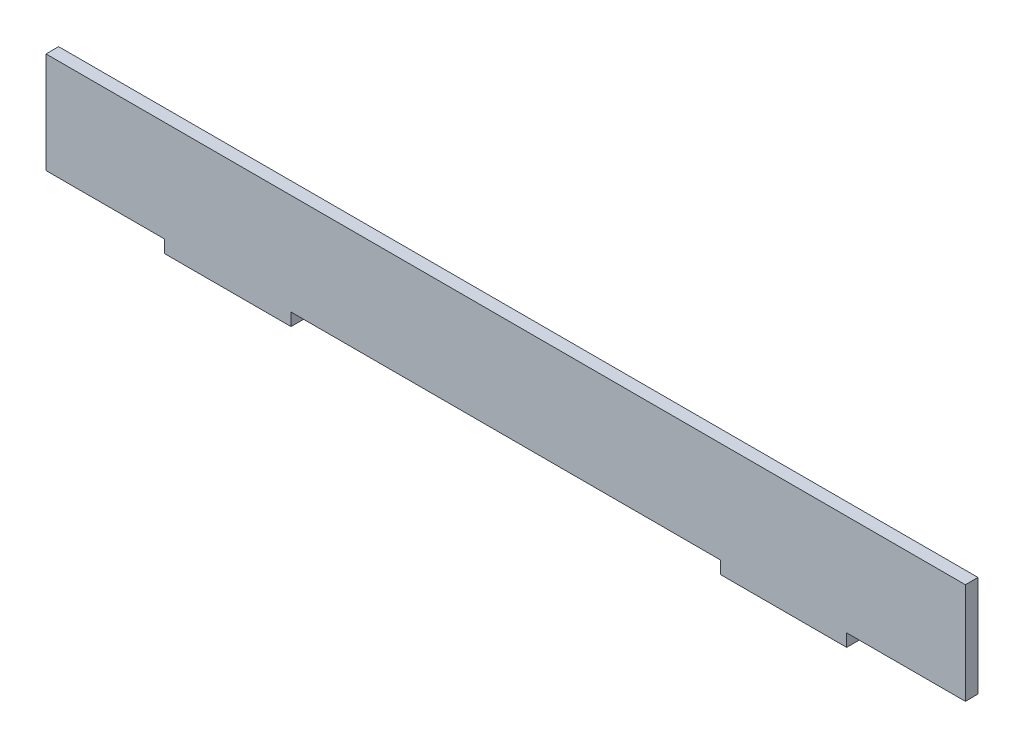
ISO-10303-21;
HEADER;
FILE_DESCRIPTION(('STEP AP214'),'2;1');
FILE_NAME('part.step','',(''),(''),'','','');
FILE_SCHEMA(('AUTOMOTIVE_DESIGN { 1 0 10303 214 1 1 1 1 }'));
ENDSEC;
DATA;
#1=APPLICATION_CONTEXT('core data for automotive mechanical design processes');
#2=APPLICATION_PROTOCOL_DEFINITION('international standard','automotive_design',2000,#1);
#3=PRODUCT_CONTEXT('',#1,'mechanical');
#4=PRODUCT('Part','Part','',(#3));
#5=PRODUCT_RELATED_PRODUCT_CATEGORY('part','',(#4));
#6=PRODUCT_DEFINITION_FORMATION('','',#4);
#7=PRODUCT_DEFINITION_CONTEXT('part definition',#1,'design');
#8=PRODUCT_DEFINITION('design','',#6,#7);
#9=PRODUCT_DEFINITION_SHAPE('','',#8);
#10=(LENGTH_UNIT() NAMED_UNIT(*) SI_UNIT(.MILLI.,.METRE.));
#11=(NAMED_UNIT(*) PLANE_ANGLE_UNIT() SI_UNIT($,.RADIAN.));
#12=(NAMED_UNIT(*) SI_UNIT($,.STERADIAN.) SOLID_ANGLE_UNIT());
#13=UNCERTAINTY_MEASURE_WITH_UNIT(LENGTH_MEASURE(1.E-05),#10,'distance_accuracy_value','');
#14=(GEOMETRIC_REPRESENTATION_CONTEXT(3) GLOBAL_UNCERTAINTY_ASSIGNED_CONTEXT((#13)) GLOBAL_UNIT_ASSIGNED_CONTEXT((#10,
#11,#12)) REPRESENTATION_CONTEXT('',''));
#15=CARTESIAN_POINT('',(0.,0.,0.));
#16=DIRECTION('',(0.,0.,1.));
#17=DIRECTION('',(1.,0.,0.));
#18=AXIS2_PLACEMENT_3D('',#15,#16,#17);
#19=CARTESIAN_POINT('',(-182.,-20.,5.));
#20=DIRECTION('',(0.,1.,0.));
#21=DIRECTION('',(0.,0.,1.));
#22=AXIS2_PLACEMENT_3D('',#19,#20,#21);
#23=PLANE('',#22);
#24=DIRECTION('',(1.,0.,0.));
#25=VECTOR('',#24,1.);
#26=CARTESIAN_POINT('',(-182.,-20.,5.));
#27=LINE('',#26,#25);
#28=CARTESIAN_POINT('',(-85.,-20.,5.));
#29=VERTEX_POINT('',#28);
#30=CARTESIAN_POINT('',(85.,-20.,5.));
#31=VERTEX_POINT('',#30);
#32=EDGE_CURVE('E50',#29,#31,#27,.T.);
#33=ORIENTED_EDGE('',*,*,#32,.F.);
#34=DIRECTION('',(0.,0.,-1.));
#35=VECTOR('',#34,1.);
#36=CARTESIAN_POINT('',(-85.,-20.,5.));
#37=LINE('',#36,#35);
#38=CARTESIAN_POINT('',(-85.,-20.,0.));
#39=VERTEX_POINT('',#38);
#40=EDGE_CURVE('E148',#29,#39,#37,.T.);
#41=ORIENTED_EDGE('',*,*,#40,.T.);
#42=DIRECTION('',(1.,0.,0.));
#43=VECTOR('',#42,1.);
#44=CARTESIAN_POINT('',(-182.,-20.,0.));
#45=LINE('',#44,#43);
#46=CARTESIAN_POINT('',(85.,-20.,0.));
#47=VERTEX_POINT('',#46);
#48=EDGE_CURVE('E209',#39,#47,#45,.T.);
#49=ORIENTED_EDGE('',*,*,#48,.T.);
#50=DIRECTION('',(0.,0.,-1.));
#51=VECTOR('',#50,1.);
#52=CARTESIAN_POINT('',(85.,-20.,5.));
#53=LINE('',#52,#51);
#54=EDGE_CURVE('E184',#31,#47,#53,.T.);
#55=ORIENTED_EDGE('',*,*,#54,.F.);
#56=EDGE_LOOP('',(#33,#41,#49,#55));
#57=FACE_BOUND('',#56,.T.);
#58=ADVANCED_FACE('F35',(#57),#23,.F.);
#59=CARTESIAN_POINT('',(-182.,-20.,0.));
#60=VERTEX_POINT('',#59);
#61=CARTESIAN_POINT('',(-135.,-20.,0.));
#62=VERTEX_POINT('',#61);
#63=EDGE_CURVE('E193',#60,#62,#45,.T.);
#64=ORIENTED_EDGE('',*,*,#63,.T.);
#65=DIRECTION('',(0.,0.,-1.));
#66=VECTOR('',#65,1.);
#67=CARTESIAN_POINT('',(-135.,-20.,5.));
#68=LINE('',#67,#66);
#69=CARTESIAN_POINT('',(-135.,-20.,5.));
#70=VERTEX_POINT('',#69);
#71=EDGE_CURVE('E58',#70,#62,#68,.T.);
#72=ORIENTED_EDGE('',*,*,#71,.F.);
#73=CARTESIAN_POINT('',(-182.,-20.,5.));
#74=VERTEX_POINT('',#73);
#75=EDGE_CURVE('E198',#74,#70,#27,.T.);
#76=ORIENTED_EDGE('',*,*,#75,.F.);
#77=DIRECTION('',(0.,0.,-1.));
#78=VECTOR('',#77,1.);
#79=CARTESIAN_POINT('',(-182.,-20.,5.));
#80=LINE('',#79,#78);
#81=EDGE_CURVE('E212',#74,#60,#80,.T.);
#82=ORIENTED_EDGE('',*,*,#81,.T.);
#83=EDGE_LOOP('',(#64,#72,#76,#82));
#84=FACE_BOUND('',#83,.T.);
#85=ADVANCED_FACE('F227',(#84),#23,.F.);
#86=CARTESIAN_POINT('',(182.,20.,5.));
#87=DIRECTION('',(-1.,0.,0.));
#88=DIRECTION('',(0.,0.,1.));
#89=AXIS2_PLACEMENT_3D('',#86,#87,#88);
#90=PLANE('',#89);
#91=DIRECTION('',(0.,1.,0.));
#92=VECTOR('',#91,1.);
#93=CARTESIAN_POINT('',(182.,20.,0.));
#94=LINE('',#93,#92);
#95=CARTESIAN_POINT('',(182.,-20.,0.));
#96=VERTEX_POINT('',#95);
#97=CARTESIAN_POINT('',(182.,20.,0.));
#98=VERTEX_POINT('',#97);
#99=EDGE_CURVE('E183',#96,#98,#94,.T.);
#100=ORIENTED_EDGE('',*,*,#99,.T.);
#101=DIRECTION('',(0.,0.,-1.));
#102=VECTOR('',#101,1.);
#103=CARTESIAN_POINT('',(182.,20.,5.));
#104=LINE('',#103,#102);
#105=CARTESIAN_POINT('',(182.,20.,5.));
#106=VERTEX_POINT('',#105);
#107=EDGE_CURVE('E11',#106,#98,#104,.T.);
#108=ORIENTED_EDGE('',*,*,#107,.F.);
#109=DIRECTION('',(0.,1.,0.));
#110=VECTOR('',#109,1.);
#111=CARTESIAN_POINT('',(182.,20.,5.));
#112=LINE('',#111,#110);
#113=CARTESIAN_POINT('',(182.,-20.,5.));
#114=VERTEX_POINT('',#113);
#115=EDGE_CURVE('E190',#114,#106,#112,.T.);
#116=ORIENTED_EDGE('',*,*,#115,.F.);
#117=DIRECTION('',(0.,0.,-1.));
#118=VECTOR('',#117,1.);
#119=CARTESIAN_POINT('',(182.,-20.,5.));
#120=LINE('',#119,#118);
#121=EDGE_CURVE('E200',#114,#96,#120,.T.);
#122=ORIENTED_EDGE('',*,*,#121,.T.);
#123=EDGE_LOOP('',(#100,#108,#116,#122));
#124=FACE_BOUND('',#123,.T.);
#125=ADVANCED_FACE('F37',(#124),#90,.F.);
#126=CARTESIAN_POINT('',(-182.,20.,5.));
#127=DIRECTION('',(0.,-1.,0.));
#128=DIRECTION('',(0.,0.,-1.));
#129=AXIS2_PLACEMENT_3D('',#126,#127,#128);
#130=PLANE('',#129);
#131=DIRECTION('',(-1.,0.,0.));
#132=VECTOR('',#131,1.);
#133=CARTESIAN_POINT('',(-182.,20.,0.));
#134=LINE('',#133,#132);
#135=CARTESIAN_POINT('',(-182.,20.,0.));
#136=VERTEX_POINT('',#135);
#137=EDGE_CURVE('E203',#98,#136,#134,.T.);
#138=ORIENTED_EDGE('',*,*,#137,.T.);
#139=DIRECTION('',(0.,0.,-1.));
#140=VECTOR('',#139,1.);
#141=CARTESIAN_POINT('',(-182.,20.,5.));
#142=LINE('',#141,#140);
#143=CARTESIAN_POINT('',(-182.,20.,5.));
#144=VERTEX_POINT('',#143);
#145=EDGE_CURVE('E43',#144,#136,#142,.T.);
#146=ORIENTED_EDGE('',*,*,#145,.F.);
#147=DIRECTION('',(-1.,0.,0.));
#148=VECTOR('',#147,1.);
#149=CARTESIAN_POINT('',(-182.,20.,5.));
#150=LINE('',#149,#148);
#151=EDGE_CURVE('E192',#106,#144,#150,.T.);
#152=ORIENTED_EDGE('',*,*,#151,.F.);
#153=ORIENTED_EDGE('',*,*,#107,.T.);
#154=EDGE_LOOP('',(#138,#146,#152,#153));
#155=FACE_BOUND('',#154,.T.);
#156=ADVANCED_FACE('F248',(#155),#130,.F.);
#157=CARTESIAN_POINT('',(-182.,20.,5.));
#158=DIRECTION('',(1.,0.,0.));
#159=DIRECTION('',(0.,1.,0.));
#160=AXIS2_PLACEMENT_3D('',#157,#158,#159);
#161=PLANE('',#160);
#162=DIRECTION('',(0.,-1.,0.));
#163=VECTOR('',#162,1.);
#164=CARTESIAN_POINT('',(-182.,20.,0.));
#165=LINE('',#164,#163);
#166=EDGE_CURVE('E205',#136,#60,#165,.T.);
#167=ORIENTED_EDGE('',*,*,#166,.T.);
#168=ORIENTED_EDGE('',*,*,#81,.F.);
#169=DIRECTION('',(0.,-1.,0.));
#170=VECTOR('',#169,1.);
#171=CARTESIAN_POINT('',(-182.,20.,5.));
#172=LINE('',#171,#170);
#173=EDGE_CURVE('E195',#144,#74,#172,.T.);
#174=ORIENTED_EDGE('',*,*,#173,.F.);
#175=ORIENTED_EDGE('',*,*,#145,.T.);
#176=EDGE_LOOP('',(#167,#168,#174,#175));
#177=FACE_BOUND('',#176,.T.);
#178=ADVANCED_FACE('F219',(#177),#161,.F.);
#179=CARTESIAN_POINT('',(135.,-20.,5.));
#180=VERTEX_POINT('',#179);
#181=EDGE_CURVE('E197',#180,#114,#27,.T.);
#182=ORIENTED_EDGE('',*,*,#181,.F.);
#183=DIRECTION('',(0.,0.,-1.));
#184=VECTOR('',#183,1.);
#185=CARTESIAN_POINT('',(135.,-20.,5.));
#186=LINE('',#185,#184);
#187=CARTESIAN_POINT('',(135.,-20.,0.));
#188=VERTEX_POINT('',#187);
#189=EDGE_CURVE('E180',#180,#188,#186,.T.);
#190=ORIENTED_EDGE('',*,*,#189,.T.);
#191=EDGE_CURVE('E207',#188,#96,#45,.T.);
#192=ORIENTED_EDGE('',*,*,#191,.T.);
#193=ORIENTED_EDGE('',*,*,#121,.F.);
#194=EDGE_LOOP('',(#182,#190,#192,#193));
#195=FACE_BOUND('',#194,.T.);
#196=ADVANCED_FACE('F233',(#195),#23,.F.);
#197=CARTESIAN_POINT('',(0.,0.,5.));
#198=DIRECTION('',(0.,0.,1.));
#199=DIRECTION('',(1.,0.,0.));
#200=AXIS2_PLACEMENT_3D('',#197,#198,#199);
#201=PLANE('',#200);
#202=ORIENTED_EDGE('',*,*,#115,.T.);
#203=ORIENTED_EDGE('',*,*,#151,.T.);
#204=ORIENTED_EDGE('',*,*,#173,.T.);
#205=ORIENTED_EDGE('',*,*,#75,.T.);
#206=DIRECTION('',(0.,1.,0.));
#207=VECTOR('',#206,1.);
#208=CARTESIAN_POINT('',(-135.,-25.,5.));
#209=LINE('',#208,#207);
#210=CARTESIAN_POINT('',(-135.,-25.,5.));
#211=VERTEX_POINT('',#210);
#212=EDGE_CURVE('E137',#211,#70,#209,.T.);
#213=ORIENTED_EDGE('',*,*,#212,.F.);
#214=DIRECTION('',(-1.,0.,0.));
#215=VECTOR('',#214,1.);
#216=CARTESIAN_POINT('',(-85.,-25.,5.));
#217=LINE('',#216,#215);
#218=CARTESIAN_POINT('',(-85.,-25.,5.));
#219=VERTEX_POINT('',#218);
#220=EDGE_CURVE('E129',#219,#211,#217,.T.);
#221=ORIENTED_EDGE('',*,*,#220,.F.);
#222=DIRECTION('',(0.,-1.,0.));
#223=VECTOR('',#222,1.);
#224=CARTESIAN_POINT('',(-85.,-25.,5.));
#225=LINE('',#224,#223);
#226=EDGE_CURVE('E144',#29,#219,#225,.T.);
#227=ORIENTED_EDGE('',*,*,#226,.F.);
#228=ORIENTED_EDGE('',*,*,#32,.T.);
#229=DIRECTION('',(0.,1.,0.));
#230=VECTOR('',#229,1.);
#231=CARTESIAN_POINT('',(85.,-25.,5.));
#232=LINE('',#231,#230);
#233=CARTESIAN_POINT('',(85.,-25.,5.));
#234=VERTEX_POINT('',#233);
#235=EDGE_CURVE('E169',#234,#31,#232,.T.);
#236=ORIENTED_EDGE('',*,*,#235,.F.);
#237=DIRECTION('',(-1.,0.,0.));
#238=VECTOR('',#237,1.);
#239=CARTESIAN_POINT('',(85.,-25.,5.));
#240=LINE('',#239,#238);
#241=CARTESIAN_POINT('',(135.,-25.,5.));
#242=VERTEX_POINT('',#241);
#243=EDGE_CURVE('E165',#242,#234,#240,.T.);
#244=ORIENTED_EDGE('',*,*,#243,.F.);
#245=DIRECTION('',(0.,-1.,0.));
#246=VECTOR('',#245,1.);
#247=CARTESIAN_POINT('',(135.,-25.,5.));
#248=LINE('',#247,#246);
#249=EDGE_CURVE('E162',#180,#242,#248,.T.);
#250=ORIENTED_EDGE('',*,*,#249,.F.);
#251=ORIENTED_EDGE('',*,*,#181,.T.);
#252=EDGE_LOOP('',(#202,#203,#204,#205,#213,#221,#227,#228,#236,#244,#250,#251));
#253=FACE_BOUND('',#252,.T.);
#254=ADVANCED_FACE('F143',(#253),#201,.T.);
#255=CARTESIAN_POINT('',(0.,0.,0.));
#256=DIRECTION('',(0.,0.,1.));
#257=DIRECTION('',(1.,0.,0.));
#258=AXIS2_PLACEMENT_3D('',#255,#256,#257);
#259=PLANE('',#258);
#260=ORIENTED_EDGE('',*,*,#99,.F.);
#261=ORIENTED_EDGE('',*,*,#191,.F.);
#262=DIRECTION('',(0.,-1.,0.));
#263=VECTOR('',#262,1.);
#264=CARTESIAN_POINT('',(135.,-25.,0.));
#265=LINE('',#264,#263);
#266=CARTESIAN_POINT('',(135.,-25.,0.));
#267=VERTEX_POINT('',#266);
#268=EDGE_CURVE('E159',#188,#267,#265,.T.);
#269=ORIENTED_EDGE('',*,*,#268,.T.);
#270=DIRECTION('',(-1.,0.,0.));
#271=VECTOR('',#270,1.);
#272=CARTESIAN_POINT('',(85.,-25.,0.));
#273=LINE('',#272,#271);
#274=CARTESIAN_POINT('',(85.,-25.,0.));
#275=VERTEX_POINT('',#274);
#276=EDGE_CURVE('E175',#267,#275,#273,.T.);
#277=ORIENTED_EDGE('',*,*,#276,.T.);
#278=DIRECTION('',(0.,1.,0.));
#279=VECTOR('',#278,1.);
#280=CARTESIAN_POINT('',(85.,-25.,0.));
#281=LINE('',#280,#279);
#282=EDGE_CURVE('E166',#275,#47,#281,.T.);
#283=ORIENTED_EDGE('',*,*,#282,.T.);
#284=ORIENTED_EDGE('',*,*,#48,.F.);
#285=DIRECTION('',(0.,-1.,0.));
#286=VECTOR('',#285,1.);
#287=CARTESIAN_POINT('',(-85.,-25.,0.));
#288=LINE('',#287,#286);
#289=CARTESIAN_POINT('',(-85.,-25.,0.));
#290=VERTEX_POINT('',#289);
#291=EDGE_CURVE('E155',#39,#290,#288,.T.);
#292=ORIENTED_EDGE('',*,*,#291,.T.);
#293=DIRECTION('',(-1.,0.,0.));
#294=VECTOR('',#293,1.);
#295=CARTESIAN_POINT('',(-85.,-25.,0.));
#296=LINE('',#295,#294);
#297=CARTESIAN_POINT('',(-135.,-25.,0.));
#298=VERTEX_POINT('',#297);
#299=EDGE_CURVE('E131',#290,#298,#296,.T.);
#300=ORIENTED_EDGE('',*,*,#299,.T.);
#301=DIRECTION('',(0.,1.,0.));
#302=VECTOR('',#301,1.);
#303=CARTESIAN_POINT('',(-135.,-25.,0.));
#304=LINE('',#303,#302);
#305=EDGE_CURVE('E149',#298,#62,#304,.T.);
#306=ORIENTED_EDGE('',*,*,#305,.T.);
#307=ORIENTED_EDGE('',*,*,#63,.F.);
#308=ORIENTED_EDGE('',*,*,#166,.F.);
#309=ORIENTED_EDGE('',*,*,#137,.F.);
#310=EDGE_LOOP('',(#260,#261,#269,#277,#283,#284,#292,#300,#306,#307,#308,#309));
#311=FACE_BOUND('',#310,.T.);
#312=ADVANCED_FACE('F225',(#311),#259,.F.);
#313=CARTESIAN_POINT('',(135.,-25.,5.));
#314=DIRECTION('',(1.,0.,0.));
#315=DIRECTION('',(0.,0.,-1.));
#316=AXIS2_PLACEMENT_3D('',#313,#314,#315);
#317=PLANE('',#316);
#318=ORIENTED_EDGE('',*,*,#268,.F.);
#319=ORIENTED_EDGE('',*,*,#189,.F.);
#320=ORIENTED_EDGE('',*,*,#249,.T.);
#321=DIRECTION('',(0.,0.,-1.));
#322=VECTOR('',#321,1.);
#323=CARTESIAN_POINT('',(135.,-25.,5.));
#324=LINE('',#323,#322);
#325=EDGE_CURVE('E172',#242,#267,#324,.T.);
#326=ORIENTED_EDGE('',*,*,#325,.T.);
#327=EDGE_LOOP('',(#318,#319,#320,#326));
#328=FACE_BOUND('',#327,.T.);
#329=ADVANCED_FACE('F262',(#328),#317,.T.);
#330=CARTESIAN_POINT('',(85.,-25.,5.));
#331=DIRECTION('',(-1.,0.,0.));
#332=DIRECTION('',(0.,0.,1.));
#333=AXIS2_PLACEMENT_3D('',#330,#331,#332);
#334=PLANE('',#333);
#335=ORIENTED_EDGE('',*,*,#282,.F.);
#336=DIRECTION('',(0.,0.,-1.));
#337=VECTOR('',#336,1.);
#338=CARTESIAN_POINT('',(85.,-25.,5.));
#339=LINE('',#338,#337);
#340=EDGE_CURVE('E187',#234,#275,#339,.T.);
#341=ORIENTED_EDGE('',*,*,#340,.F.);
#342=ORIENTED_EDGE('',*,*,#235,.T.);
#343=ORIENTED_EDGE('',*,*,#54,.T.);
#344=EDGE_LOOP('',(#335,#341,#342,#343));
#345=FACE_BOUND('',#344,.T.);
#346=ADVANCED_FACE('F257',(#345),#334,.T.);
#347=CARTESIAN_POINT('',(85.,-25.,5.));
#348=DIRECTION('',(0.,-1.,0.));
#349=DIRECTION('',(1.,0.,0.));
#350=AXIS2_PLACEMENT_3D('',#347,#348,#349);
#351=PLANE('',#350);
#352=ORIENTED_EDGE('',*,*,#276,.F.);
#353=ORIENTED_EDGE('',*,*,#325,.F.);
#354=ORIENTED_EDGE('',*,*,#243,.T.);
#355=ORIENTED_EDGE('',*,*,#340,.T.);
#356=EDGE_LOOP('',(#352,#353,#354,#355));
#357=FACE_BOUND('',#356,.T.);
#358=ADVANCED_FACE('F260',(#357),#351,.T.);
#359=CARTESIAN_POINT('',(-85.,-25.,5.));
#360=DIRECTION('',(1.,0.,0.));
#361=DIRECTION('',(0.,0.,-1.));
#362=AXIS2_PLACEMENT_3D('',#359,#360,#361);
#363=PLANE('',#362);
#364=ORIENTED_EDGE('',*,*,#291,.F.);
#365=ORIENTED_EDGE('',*,*,#40,.F.);
#366=ORIENTED_EDGE('',*,*,#226,.T.);
#367=DIRECTION('',(0.,0.,-1.));
#368=VECTOR('',#367,1.);
#369=CARTESIAN_POINT('',(-85.,-25.,5.));
#370=LINE('',#369,#368);
#371=EDGE_CURVE('E126',#219,#290,#370,.T.);
#372=ORIENTED_EDGE('',*,*,#371,.T.);
#373=EDGE_LOOP('',(#364,#365,#366,#372));
#374=FACE_BOUND('',#373,.T.);
#375=ADVANCED_FACE('F147',(#374),#363,.T.);
#376=CARTESIAN_POINT('',(-135.,-25.,5.));
#377=DIRECTION('',(-1.,0.,0.));
#378=DIRECTION('',(0.,0.,1.));
#379=AXIS2_PLACEMENT_3D('',#376,#377,#378);
#380=PLANE('',#379);
#381=ORIENTED_EDGE('',*,*,#305,.F.);
#382=DIRECTION('',(0.,0.,-1.));
#383=VECTOR('',#382,1.);
#384=CARTESIAN_POINT('',(-135.,-25.,5.));
#385=LINE('',#384,#383);
#386=EDGE_CURVE('E136',#211,#298,#385,.T.);
#387=ORIENTED_EDGE('',*,*,#386,.F.);
#388=ORIENTED_EDGE('',*,*,#212,.T.);
#389=ORIENTED_EDGE('',*,*,#71,.T.);
#390=EDGE_LOOP('',(#381,#387,#388,#389));
#391=FACE_BOUND('',#390,.T.);
#392=ADVANCED_FACE('F229',(#391),#380,.T.);
#393=CARTESIAN_POINT('',(-85.,-25.,5.));
#394=DIRECTION('',(0.,-1.,0.));
#395=DIRECTION('',(1.,0.,0.));
#396=AXIS2_PLACEMENT_3D('',#393,#394,#395);
#397=PLANE('',#396);
#398=ORIENTED_EDGE('',*,*,#299,.F.);
#399=ORIENTED_EDGE('',*,*,#371,.F.);
#400=ORIENTED_EDGE('',*,*,#220,.T.);
#401=ORIENTED_EDGE('',*,*,#386,.T.);
#402=EDGE_LOOP('',(#398,#399,#400,#401));
#403=FACE_BOUND('',#402,.T.);
#404=ADVANCED_FACE('F128',(#403),#397,.T.);
#405=CLOSED_SHELL('',(#58,#85,#125,#156,#178,#196,#254,#312,#329,#346,#358,#375,#392,#404));
#406=MANIFOLD_SOLID_BREP('B2',#405);
#407=ADVANCED_BREP_SHAPE_REPRESENTATION('',(#18,#406),#14);
#408=SHAPE_DEFINITION_REPRESENTATION(#9,#407);
ENDSEC;
END-ISO-10303-21;
